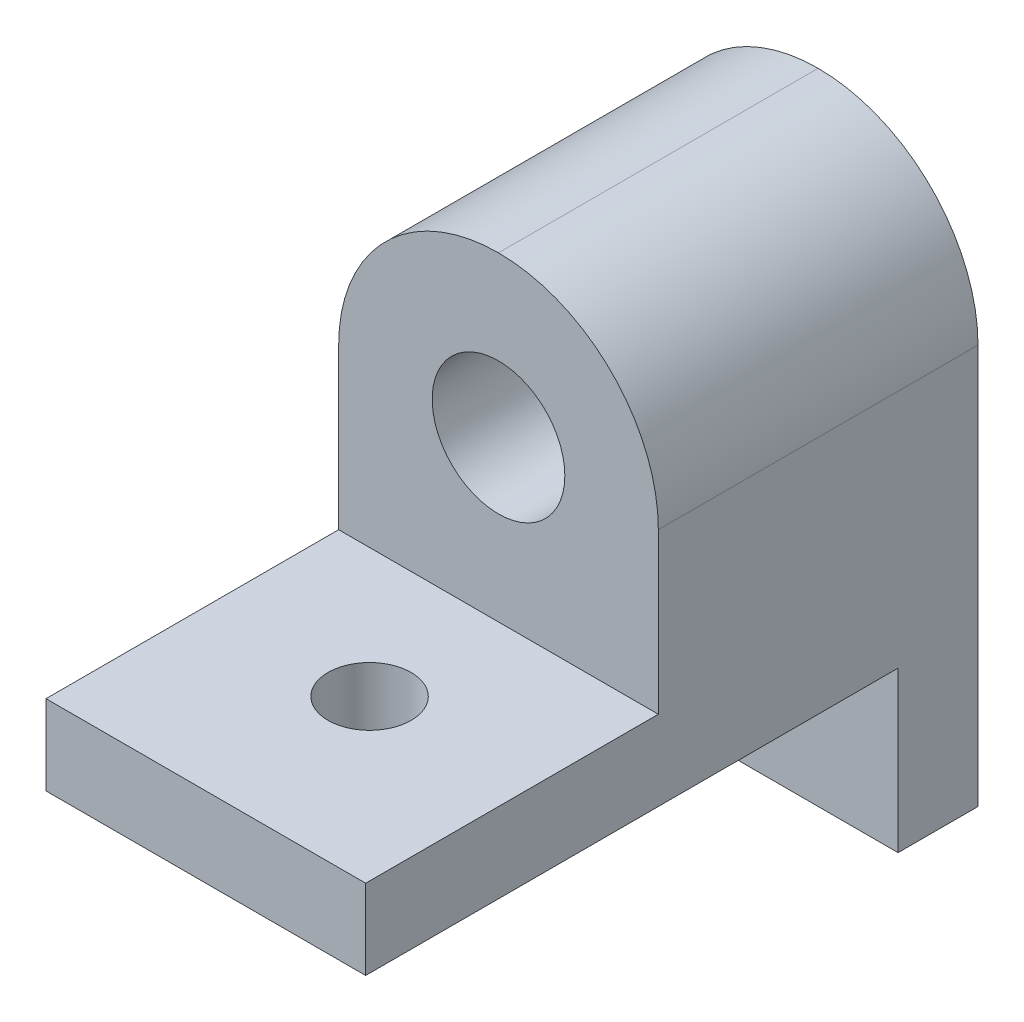
ISO-10303-21;
HEADER;
FILE_DESCRIPTION(('STEP AP214'),'2;1');
FILE_NAME('part.step','',(''),(''),'','','');
FILE_SCHEMA(('AUTOMOTIVE_DESIGN { 1 0 10303 214 1 1 1 1 }'));
ENDSEC;
DATA;
#1=APPLICATION_CONTEXT('core data for automotive mechanical design processes');
#2=APPLICATION_PROTOCOL_DEFINITION('international standard','automotive_design',2000,#1);
#3=PRODUCT_CONTEXT('',#1,'mechanical');
#4=PRODUCT('Part','Part','',(#3));
#5=PRODUCT_RELATED_PRODUCT_CATEGORY('part','',(#4));
#6=PRODUCT_DEFINITION_FORMATION('','',#4);
#7=PRODUCT_DEFINITION_CONTEXT('part definition',#1,'design');
#8=PRODUCT_DEFINITION('design','',#6,#7);
#9=PRODUCT_DEFINITION_SHAPE('','',#8);
#10=(LENGTH_UNIT() NAMED_UNIT(*) SI_UNIT(.MILLI.,.METRE.));
#11=(NAMED_UNIT(*) PLANE_ANGLE_UNIT() SI_UNIT($,.RADIAN.));
#12=(NAMED_UNIT(*) SI_UNIT($,.STERADIAN.) SOLID_ANGLE_UNIT());
#13=UNCERTAINTY_MEASURE_WITH_UNIT(LENGTH_MEASURE(1.E-05),#10,'distance_accuracy_value','');
#14=(GEOMETRIC_REPRESENTATION_CONTEXT(3) GLOBAL_UNCERTAINTY_ASSIGNED_CONTEXT((#13)) GLOBAL_UNIT_ASSIGNED_CONTEXT((#10,
#11,#12)) REPRESENTATION_CONTEXT('',''));
#15=CARTESIAN_POINT('',(0.,0.,0.));
#16=DIRECTION('',(0.,0.,1.));
#17=DIRECTION('',(1.,0.,0.));
#18=AXIS2_PLACEMENT_3D('',#15,#16,#17);
#19=CARTESIAN_POINT('',(0.,0.,0.));
#20=DIRECTION('',(0.,1.,0.));
#21=DIRECTION('',(0.,0.,1.));
#22=AXIS2_PLACEMENT_3D('',#19,#20,#21);
#23=PLANE('',#22);
#24=CARTESIAN_POINT('',(2.63414634146342,0.,46.221727325495));
#25=DIRECTION('',(0.,1.,0.));
#26=DIRECTION('',(0.,0.,1.));
#27=AXIS2_PLACEMENT_3D('',#24,#25,#26);
#28=CIRCLE('',#27,2.6);
#29=CARTESIAN_POINT('',(2.63414634146342,0.,48.821727325495));
#30=VERTEX_POINT('',#29);
#31=EDGE_CURVE('E244',#30,#30,#28,.T.);
#32=ORIENTED_EDGE('',*,*,#31,.T.);
#33=EDGE_LOOP('',(#32));
#34=FACE_BOUND('',#33,.T.);
#35=DIRECTION('',(0.,0.,-1.));
#36=VECTOR('',#35,1.);
#37=CARTESIAN_POINT('',(12.6341463414634,0.,8.15414281074482));
#38=LINE('',#37,#36);
#39=CARTESIAN_POINT('',(12.6341463414634,0.,56.4651348857552));
#40=VERTEX_POINT('',#39);
#41=CARTESIAN_POINT('',(12.6341463414634,0.,23.1541428107448));
#42=VERTEX_POINT('',#41);
#43=EDGE_CURVE('E62',#40,#42,#38,.T.);
#44=ORIENTED_EDGE('',*,*,#43,.F.);
#45=DIRECTION('',(-1.,0.,0.));
#46=VECTOR('',#45,1.);
#47=CARTESIAN_POINT('',(0.,0.,56.4651348857552));
#48=LINE('',#47,#46);
#49=CARTESIAN_POINT('',(-7.36585365853658,0.,56.4651348857552));
#50=VERTEX_POINT('',#49);
#51=EDGE_CURVE('E127',#40,#50,#48,.T.);
#52=ORIENTED_EDGE('',*,*,#51,.T.);
#53=DIRECTION('',(0.,0.,1.));
#54=VECTOR('',#53,1.);
#55=CARTESIAN_POINT('',(-7.36585365853658,0.,8.15414281074482));
#56=LINE('',#55,#54);
#57=CARTESIAN_POINT('',(-7.36585365853658,0.,23.1541428107448));
#58=VERTEX_POINT('',#57);
#59=EDGE_CURVE('E125',#58,#50,#56,.T.);
#60=ORIENTED_EDGE('',*,*,#59,.F.);
#61=DIRECTION('',(-1.,0.,0.));
#62=VECTOR('',#61,1.);
#63=CARTESIAN_POINT('',(-7.36585365853658,0.,23.1541428107448));
#64=LINE('',#63,#62);
#65=EDGE_CURVE('E225',#42,#58,#64,.T.);
#66=ORIENTED_EDGE('',*,*,#65,.F.);
#67=EDGE_LOOP('',(#44,#52,#60,#66));
#68=FACE_BOUND('',#67,.T.);
#69=ADVANCED_FACE('F38',(#34,#68),#23,.F.);
#70=CARTESIAN_POINT('',(-7.36585365853658,5.,8.15414281074482));
#71=DIRECTION('',(1.,0.,0.));
#72=DIRECTION('',(0.,0.,-1.));
#73=AXIS2_PLACEMENT_3D('',#70,#71,#72);
#74=PLANE('',#73);
#75=ORIENTED_EDGE('',*,*,#59,.T.);
#76=DIRECTION('',(0.,1.,0.));
#77=VECTOR('',#76,1.);
#78=CARTESIAN_POINT('',(-7.36585365853658,-10.,56.4651348857552));
#79=LINE('',#78,#77);
#80=CARTESIAN_POINT('',(-7.36585365853658,5.,56.4651348857552));
#81=VERTEX_POINT('',#80);
#82=EDGE_CURVE('E111',#50,#81,#79,.T.);
#83=ORIENTED_EDGE('',*,*,#82,.T.);
#84=DIRECTION('',(0.,0.,1.));
#85=VECTOR('',#84,1.);
#86=CARTESIAN_POINT('',(-7.36585365853658,5.,8.15414281074482));
#87=LINE('',#86,#85);
#88=CARTESIAN_POINT('',(-7.36585365853658,5.,38.1541428107448));
#89=VERTEX_POINT('',#88);
#90=EDGE_CURVE('E123',#89,#81,#87,.T.);
#91=ORIENTED_EDGE('',*,*,#90,.F.);
#92=DIRECTION('',(0.,-1.,0.));
#93=VECTOR('',#92,1.);
#94=CARTESIAN_POINT('',(-7.36585365853658,25.,38.1541428107448));
#95=LINE('',#94,#93);
#96=CARTESIAN_POINT('',(-7.36585365853658,15.,38.1541428107448));
#97=VERTEX_POINT('',#96);
#98=EDGE_CURVE('E143',#97,#89,#95,.T.);
#99=ORIENTED_EDGE('',*,*,#98,.F.);
#100=DIRECTION('',(0.,0.,1.));
#101=VECTOR('',#100,1.);
#102=CARTESIAN_POINT('',(-7.36585365853658,15.,18.1541428107448));
#103=LINE('',#102,#101);
#104=CARTESIAN_POINT('',(-7.36585365853658,15.,18.1541428107448));
#105=VERTEX_POINT('',#104);
#106=EDGE_CURVE('E11',#97,#105,#103,.F.);
#107=ORIENTED_EDGE('',*,*,#106,.T.);
#108=DIRECTION('',(0.,-1.,0.));
#109=VECTOR('',#108,1.);
#110=CARTESIAN_POINT('',(-7.36585365853658,25.,18.1541428107448));
#111=LINE('',#110,#109);
#112=CARTESIAN_POINT('',(-7.36585365853658,-10.,18.1541428107448));
#113=VERTEX_POINT('',#112);
#114=EDGE_CURVE('E200',#105,#113,#111,.T.);
#115=ORIENTED_EDGE('',*,*,#114,.T.);
#116=DIRECTION('',(0.,0.,-1.));
#117=VECTOR('',#116,1.);
#118=CARTESIAN_POINT('',(-7.36585365853658,-10.,18.1541428107448));
#119=LINE('',#118,#117);
#120=CARTESIAN_POINT('',(-7.36585365853658,-10.,23.1541428107448));
#121=VERTEX_POINT('',#120);
#122=EDGE_CURVE('E220',#121,#113,#119,.T.);
#123=ORIENTED_EDGE('',*,*,#122,.F.);
#124=DIRECTION('',(0.,1.,0.));
#125=VECTOR('',#124,1.);
#126=CARTESIAN_POINT('',(-7.36585365853658,-10.,23.1541428107448));
#127=LINE('',#126,#125);
#128=EDGE_CURVE('E188',#121,#58,#127,.T.);
#129=ORIENTED_EDGE('',*,*,#128,.T.);
#130=EDGE_LOOP('',(#75,#83,#91,#99,#107,#115,#123,#129));
#131=FACE_BOUND('',#130,.T.);
#132=ADVANCED_FACE('F121',(#131),#74,.F.);
#133=CARTESIAN_POINT('',(12.6341463414634,5.,8.15414281074482));
#134=DIRECTION('',(-1.,0.,0.));
#135=DIRECTION('',(0.,0.,1.));
#136=AXIS2_PLACEMENT_3D('',#133,#134,#135);
#137=PLANE('',#136);
#138=DIRECTION('',(0.,0.,-1.));
#139=VECTOR('',#138,1.);
#140=CARTESIAN_POINT('',(12.6341463414634,5.,8.15414281074482));
#141=LINE('',#140,#139);
#142=CARTESIAN_POINT('',(12.6341463414634,5.,56.4651348857552));
#143=VERTEX_POINT('',#142);
#144=CARTESIAN_POINT('',(12.6341463414634,5.,38.1541428107448));
#145=VERTEX_POINT('',#144);
#146=EDGE_CURVE('E135',#143,#145,#141,.T.);
#147=ORIENTED_EDGE('',*,*,#146,.F.);
#148=DIRECTION('',(0.,1.,0.));
#149=VECTOR('',#148,1.);
#150=CARTESIAN_POINT('',(12.6341463414634,-10.,56.4651348857552));
#151=LINE('',#150,#149);
#152=EDGE_CURVE('E55',#40,#143,#151,.T.);
#153=ORIENTED_EDGE('',*,*,#152,.F.);
#154=ORIENTED_EDGE('',*,*,#43,.T.);
#155=DIRECTION('',(0.,1.,0.));
#156=VECTOR('',#155,1.);
#157=CARTESIAN_POINT('',(12.6341463414634,-10.,23.1541428107448));
#158=LINE('',#157,#156);
#159=CARTESIAN_POINT('',(12.6341463414634,-10.,23.1541428107448));
#160=VERTEX_POINT('',#159);
#161=EDGE_CURVE('E182',#160,#42,#158,.T.);
#162=ORIENTED_EDGE('',*,*,#161,.F.);
#163=DIRECTION('',(0.,0.,1.));
#164=VECTOR('',#163,1.);
#165=CARTESIAN_POINT('',(12.6341463414634,-10.,18.1541428107448));
#166=LINE('',#165,#164);
#167=CARTESIAN_POINT('',(12.6341463414634,-10.,18.1541428107448));
#168=VERTEX_POINT('',#167);
#169=EDGE_CURVE('E219',#168,#160,#166,.T.);
#170=ORIENTED_EDGE('',*,*,#169,.F.);
#171=DIRECTION('',(0.,-1.,0.));
#172=VECTOR('',#171,1.);
#173=CARTESIAN_POINT('',(12.6341463414634,25.,18.1541428107448));
#174=LINE('',#173,#172);
#175=CARTESIAN_POINT('',(12.6341463414634,15.,18.1541428107448));
#176=VERTEX_POINT('',#175);
#177=EDGE_CURVE('E203',#176,#168,#174,.T.);
#178=ORIENTED_EDGE('',*,*,#177,.F.);
#179=DIRECTION('',(0.,0.,-1.));
#180=VECTOR('',#179,1.);
#181=CARTESIAN_POINT('',(12.6341463414634,15.,38.1541428107448));
#182=LINE('',#181,#180);
#183=CARTESIAN_POINT('',(12.6341463414634,15.,38.1541428107448));
#184=VERTEX_POINT('',#183);
#185=EDGE_CURVE('E158',#176,#184,#182,.F.);
#186=ORIENTED_EDGE('',*,*,#185,.T.);
#187=DIRECTION('',(0.,-1.,0.));
#188=VECTOR('',#187,1.);
#189=CARTESIAN_POINT('',(12.6341463414634,25.,38.1541428107448));
#190=LINE('',#189,#188);
#191=EDGE_CURVE('E171',#184,#145,#190,.T.);
#192=ORIENTED_EDGE('',*,*,#191,.T.);
#193=EDGE_LOOP('',(#147,#153,#154,#162,#170,#178,#186,#192));
#194=FACE_BOUND('',#193,.T.);
#195=ADVANCED_FACE('F236',(#194),#137,.F.);
#196=CARTESIAN_POINT('',(0.,5.,0.));
#197=DIRECTION('',(0.,1.,0.));
#198=DIRECTION('',(0.,0.,1.));
#199=AXIS2_PLACEMENT_3D('',#196,#197,#198);
#200=PLANE('',#199);
#201=DIRECTION('',(-1.,0.,0.));
#202=VECTOR('',#201,1.);
#203=CARTESIAN_POINT('',(-7.36585365853658,5.,56.4651348857552));
#204=LINE('',#203,#202);
#205=EDGE_CURVE('E108',#143,#81,#204,.T.);
#206=ORIENTED_EDGE('',*,*,#205,.F.);
#207=ORIENTED_EDGE('',*,*,#146,.T.);
#208=DIRECTION('',(1.,0.,0.));
#209=VECTOR('',#208,1.);
#210=CARTESIAN_POINT('',(-7.36585365853658,5.,38.1541428107448));
#211=LINE('',#210,#209);
#212=EDGE_CURVE('E133',#89,#145,#211,.T.);
#213=ORIENTED_EDGE('',*,*,#212,.F.);
#214=ORIENTED_EDGE('',*,*,#90,.T.);
#215=EDGE_LOOP('',(#206,#207,#213,#214));
#216=FACE_BOUND('',#215,.T.);
#217=CARTESIAN_POINT('',(2.63414634146342,5.,46.221727325495));
#218=DIRECTION('',(0.,1.,0.));
#219=DIRECTION('',(0.,0.,1.));
#220=AXIS2_PLACEMENT_3D('',#217,#218,#219);
#221=CIRCLE('',#220,2.6);
#222=CARTESIAN_POINT('',(2.63414634146342,5.,48.821727325495));
#223=VERTEX_POINT('',#222);
#224=EDGE_CURVE('E240',#223,#223,#221,.T.);
#225=ORIENTED_EDGE('',*,*,#224,.F.);
#226=EDGE_LOOP('',(#225));
#227=FACE_BOUND('',#226,.T.);
#228=ADVANCED_FACE('F130',(#216,#227),#200,.T.);
#229=CARTESIAN_POINT('',(-7.36585365853658,25.,38.1541428107448));
#230=DIRECTION('',(0.,0.,-1.));
#231=DIRECTION('',(-1.,0.,0.));
#232=AXIS2_PLACEMENT_3D('',#229,#230,#231);
#233=PLANE('',#232);
#234=CARTESIAN_POINT('',(2.63414634146342,15.,38.1541428107448));
#235=DIRECTION('',(0.,0.,1.));
#236=DIRECTION('',(1.,0.,0.));
#237=AXIS2_PLACEMENT_3D('',#234,#235,#236);
#238=CIRCLE('',#237,4.15);
#239=CARTESIAN_POINT('',(6.78414634146342,15.,38.1541428107448));
#240=VERTEX_POINT('',#239);
#241=EDGE_CURVE('E152',#240,#240,#238,.T.);
#242=ORIENTED_EDGE('',*,*,#241,.F.);
#243=EDGE_LOOP('',(#242));
#244=FACE_BOUND('',#243,.T.);
#245=ORIENTED_EDGE('',*,*,#191,.F.);
#246=CARTESIAN_POINT('',(2.63414634146342,15.,38.1541428107448));
#247=DIRECTION('',(0.,0.,-1.));
#248=DIRECTION('',(-1.,0.,0.));
#249=AXIS2_PLACEMENT_3D('',#246,#247,#248);
#250=CIRCLE('',#249,10.);
#251=CARTESIAN_POINT('',(2.63414634146342,25.,38.1541428107448));
#252=VERTEX_POINT('',#251);
#253=EDGE_CURVE('E48',#184,#252,#250,.F.);
#254=ORIENTED_EDGE('',*,*,#253,.T.);
#255=CARTESIAN_POINT('',(2.63414634146342,15.,38.1541428107448));
#256=DIRECTION('',(0.,0.,-1.));
#257=DIRECTION('',(-1.,0.,0.));
#258=AXIS2_PLACEMENT_3D('',#255,#256,#257);
#259=CIRCLE('',#258,10.);
#260=EDGE_CURVE('E162',#252,#97,#259,.F.);
#261=ORIENTED_EDGE('',*,*,#260,.T.);
#262=ORIENTED_EDGE('',*,*,#98,.T.);
#263=ORIENTED_EDGE('',*,*,#212,.T.);
#264=EDGE_LOOP('',(#245,#254,#261,#262,#263));
#265=FACE_BOUND('',#264,.T.);
#266=ADVANCED_FACE('F169',(#244,#265),#233,.F.);
#267=CARTESIAN_POINT('',(-7.36585365853658,25.,18.1541428107448));
#268=DIRECTION('',(0.,0.,1.));
#269=DIRECTION('',(1.,0.,0.));
#270=AXIS2_PLACEMENT_3D('',#267,#268,#269);
#271=PLANE('',#270);
#272=CARTESIAN_POINT('',(2.63414634146342,-5.,18.1541428107448));
#273=DIRECTION('',(0.,0.,1.));
#274=DIRECTION('',(1.,0.,0.));
#275=AXIS2_PLACEMENT_3D('',#272,#273,#274);
#276=CIRCLE('',#275,1.6);
#277=CARTESIAN_POINT('',(4.23414634146342,-5.,18.1541428107448));
#278=VERTEX_POINT('',#277);
#279=EDGE_CURVE('E228',#278,#278,#276,.T.);
#280=ORIENTED_EDGE('',*,*,#279,.T.);
#281=EDGE_LOOP('',(#280));
#282=FACE_BOUND('',#281,.T.);
#283=CARTESIAN_POINT('',(2.63414634146342,15.,18.1541428107448));
#284=DIRECTION('',(0.,0.,1.));
#285=DIRECTION('',(1.,0.,0.));
#286=AXIS2_PLACEMENT_3D('',#283,#284,#285);
#287=CIRCLE('',#286,4.15);
#288=CARTESIAN_POINT('',(6.78414634146342,15.,18.1541428107448));
#289=VERTEX_POINT('',#288);
#290=EDGE_CURVE('E148',#289,#289,#287,.T.);
#291=ORIENTED_EDGE('',*,*,#290,.T.);
#292=EDGE_LOOP('',(#291));
#293=FACE_BOUND('',#292,.T.);
#294=CARTESIAN_POINT('',(2.63414634146342,15.,18.1541428107448));
#295=DIRECTION('',(0.,0.,1.));
#296=DIRECTION('',(1.,0.,0.));
#297=AXIS2_PLACEMENT_3D('',#294,#295,#296);
#298=CIRCLE('',#297,10.);
#299=CARTESIAN_POINT('',(2.63414634146342,25.,18.1541428107448));
#300=VERTEX_POINT('',#299);
#301=EDGE_CURVE('E139',#105,#300,#298,.F.);
#302=ORIENTED_EDGE('',*,*,#301,.T.);
#303=CARTESIAN_POINT('',(2.63414634146342,15.,18.1541428107448));
#304=DIRECTION('',(0.,0.,1.));
#305=DIRECTION('',(1.,0.,0.));
#306=AXIS2_PLACEMENT_3D('',#303,#304,#305);
#307=CIRCLE('',#306,10.);
#308=EDGE_CURVE('E155',#300,#176,#307,.F.);
#309=ORIENTED_EDGE('',*,*,#308,.T.);
#310=ORIENTED_EDGE('',*,*,#177,.T.);
#311=DIRECTION('',(1.,0.,0.));
#312=VECTOR('',#311,1.);
#313=CARTESIAN_POINT('',(-7.36585365853658,-10.,18.1541428107448));
#314=LINE('',#313,#312);
#315=EDGE_CURVE('E213',#113,#168,#314,.T.);
#316=ORIENTED_EDGE('',*,*,#315,.F.);
#317=ORIENTED_EDGE('',*,*,#114,.F.);
#318=EDGE_LOOP('',(#302,#309,#310,#316,#317));
#319=FACE_BOUND('',#318,.T.);
#320=ADVANCED_FACE('F211',(#282,#293,#319),#271,.F.);
#321=CARTESIAN_POINT('',(2.63414634146342,15.,8.15414281074482));
#322=DIRECTION('',(0.,0.,1.));
#323=DIRECTION('',(1.,0.,0.));
#324=AXIS2_PLACEMENT_3D('',#321,#322,#323);
#325=CYLINDRICAL_SURFACE('',#324,4.15);
#326=ORIENTED_EDGE('',*,*,#241,.T.);
#327=EDGE_LOOP('',(#326));
#328=FACE_BOUND('',#327,.T.);
#329=ORIENTED_EDGE('',*,*,#290,.F.);
#330=EDGE_LOOP('',(#329));
#331=FACE_BOUND('',#330,.T.);
#332=ADVANCED_FACE('F291',(#328,#331),#325,.F.);
#333=CARTESIAN_POINT('',(2.63414634146342,15.,0.));
#334=DIRECTION('',(0.,0.,-1.));
#335=DIRECTION('',(-1.,0.,0.));
#336=AXIS2_PLACEMENT_3D('',#333,#334,#335);
#337=CYLINDRICAL_SURFACE('',#336,10.);
#338=ORIENTED_EDGE('',*,*,#106,.F.);
#339=ORIENTED_EDGE('',*,*,#260,.F.);
#340=DIRECTION('',(0.,0.,1.));
#341=VECTOR('',#340,1.);
#342=CARTESIAN_POINT('',(2.63414634146342,25.,38.1541428107448));
#343=LINE('',#342,#341);
#344=EDGE_CURVE('E42',#300,#252,#343,.T.);
#345=ORIENTED_EDGE('',*,*,#344,.F.);
#346=ORIENTED_EDGE('',*,*,#301,.F.);
#347=EDGE_LOOP('',(#338,#339,#345,#346));
#348=FACE_BOUND('',#347,.T.);
#349=ADVANCED_FACE('F40',(#348),#337,.T.);
#350=CARTESIAN_POINT('',(2.63414634146342,15.,0.));
#351=DIRECTION('',(0.,0.,1.));
#352=DIRECTION('',(1.,0.,0.));
#353=AXIS2_PLACEMENT_3D('',#350,#351,#352);
#354=CYLINDRICAL_SURFACE('',#353,10.);
#355=ORIENTED_EDGE('',*,*,#253,.F.);
#356=ORIENTED_EDGE('',*,*,#185,.F.);
#357=ORIENTED_EDGE('',*,*,#308,.F.);
#358=ORIENTED_EDGE('',*,*,#344,.T.);
#359=EDGE_LOOP('',(#355,#356,#357,#358));
#360=FACE_BOUND('',#359,.T.);
#361=ADVANCED_FACE('F180',(#360),#354,.T.);
#362=CARTESIAN_POINT('',(-7.36585365853658,-10.,23.1541428107448));
#363=DIRECTION('',(0.,0.,-1.));
#364=DIRECTION('',(-1.,0.,0.));
#365=AXIS2_PLACEMENT_3D('',#362,#363,#364);
#366=PLANE('',#365);
#367=CARTESIAN_POINT('',(2.63414634146342,-5.,23.1541428107448));
#368=DIRECTION('',(0.,0.,1.));
#369=DIRECTION('',(1.,0.,0.));
#370=AXIS2_PLACEMENT_3D('',#367,#368,#369);
#371=CIRCLE('',#370,1.6);
#372=CARTESIAN_POINT('',(4.23414634146342,-5.,23.1541428107448));
#373=VERTEX_POINT('',#372);
#374=EDGE_CURVE('E230',#373,#373,#371,.T.);
#375=ORIENTED_EDGE('',*,*,#374,.F.);
#376=EDGE_LOOP('',(#375));
#377=FACE_BOUND('',#376,.T.);
#378=ORIENTED_EDGE('',*,*,#65,.T.);
#379=ORIENTED_EDGE('',*,*,#128,.F.);
#380=DIRECTION('',(-1.,0.,0.));
#381=VECTOR('',#380,1.);
#382=CARTESIAN_POINT('',(-7.36585365853658,-10.,23.1541428107448));
#383=LINE('',#382,#381);
#384=EDGE_CURVE('E194',#160,#121,#383,.T.);
#385=ORIENTED_EDGE('',*,*,#384,.F.);
#386=ORIENTED_EDGE('',*,*,#161,.T.);
#387=EDGE_LOOP('',(#378,#379,#385,#386));
#388=FACE_BOUND('',#387,.T.);
#389=ADVANCED_FACE('F237',(#377,#388),#366,.F.);
#390=CARTESIAN_POINT('',(0.,-10.,0.));
#391=DIRECTION('',(0.,1.,0.));
#392=DIRECTION('',(0.,0.,1.));
#393=AXIS2_PLACEMENT_3D('',#390,#391,#392);
#394=PLANE('',#393);
#395=ORIENTED_EDGE('',*,*,#122,.T.);
#396=ORIENTED_EDGE('',*,*,#315,.T.);
#397=ORIENTED_EDGE('',*,*,#169,.T.);
#398=ORIENTED_EDGE('',*,*,#384,.T.);
#399=EDGE_LOOP('',(#395,#396,#397,#398));
#400=FACE_BOUND('',#399,.T.);
#401=ADVANCED_FACE('F222',(#400),#394,.F.);
#402=CARTESIAN_POINT('',(2.63414634146342,-5.,18.1541428107448));
#403=DIRECTION('',(0.,0.,1.));
#404=DIRECTION('',(1.,0.,0.));
#405=AXIS2_PLACEMENT_3D('',#402,#403,#404);
#406=CYLINDRICAL_SURFACE('',#405,1.6);
#407=ORIENTED_EDGE('',*,*,#279,.F.);
#408=EDGE_LOOP('',(#407));
#409=FACE_BOUND('',#408,.T.);
#410=ORIENTED_EDGE('',*,*,#374,.T.);
#411=EDGE_LOOP('',(#410));
#412=FACE_BOUND('',#411,.T.);
#413=ADVANCED_FACE('F258',(#409,#412),#406,.F.);
#414=CARTESIAN_POINT('',(2.63414634146342,-10.,46.221727325495));
#415=DIRECTION('',(0.,1.,0.));
#416=DIRECTION('',(0.,0.,1.));
#417=AXIS2_PLACEMENT_3D('',#414,#415,#416);
#418=CYLINDRICAL_SURFACE('',#417,2.6);
#419=ORIENTED_EDGE('',*,*,#224,.T.);
#420=EDGE_LOOP('',(#419));
#421=FACE_BOUND('',#420,.T.);
#422=ORIENTED_EDGE('',*,*,#31,.F.);
#423=EDGE_LOOP('',(#422));
#424=FACE_BOUND('',#423,.T.);
#425=ADVANCED_FACE('F335',(#421,#424),#418,.F.);
#426=CARTESIAN_POINT('',(-7.36585365853658,-10.,56.4651348857552));
#427=DIRECTION('',(0.,0.,-1.));
#428=DIRECTION('',(-1.,0.,0.));
#429=AXIS2_PLACEMENT_3D('',#426,#427,#428);
#430=PLANE('',#429);
#431=ORIENTED_EDGE('',*,*,#152,.T.);
#432=ORIENTED_EDGE('',*,*,#205,.T.);
#433=ORIENTED_EDGE('',*,*,#82,.F.);
#434=ORIENTED_EDGE('',*,*,#51,.F.);
#435=EDGE_LOOP('',(#431,#432,#433,#434));
#436=FACE_BOUND('',#435,.T.);
#437=ADVANCED_FACE('F110',(#436),#430,.F.);
#438=CLOSED_SHELL('',(#69,#132,#195,#228,#266,#320,#332,#349,#361,#389,#401,#413,#425,#437));
#439=MANIFOLD_SOLID_BREP('B2',#438);
#440=ADVANCED_BREP_SHAPE_REPRESENTATION('',(#18,#439),#14);
#441=SHAPE_DEFINITION_REPRESENTATION(#9,#440);
ENDSEC;
END-ISO-10303-21;
